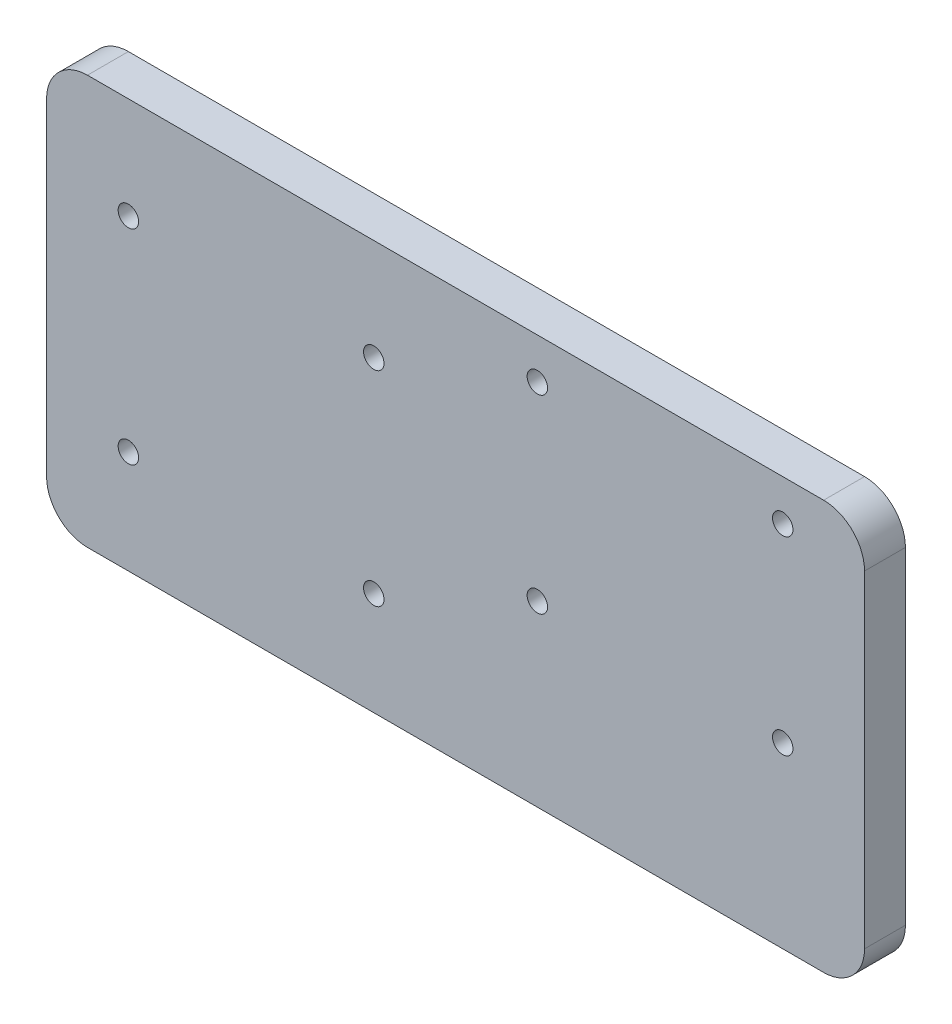
ISO-10303-21;
HEADER;
FILE_DESCRIPTION(('STEP AP214'),'2;1');
FILE_NAME('part.step','',(''),(''),'','','');
FILE_SCHEMA(('AUTOMOTIVE_DESIGN { 1 0 10303 214 1 1 1 1 }'));
ENDSEC;
DATA;
#1=APPLICATION_CONTEXT('core data for automotive mechanical design processes');
#2=APPLICATION_PROTOCOL_DEFINITION('international standard','automotive_design',2000,#1);
#3=PRODUCT_CONTEXT('',#1,'mechanical');
#4=PRODUCT('Part','Part','',(#3));
#5=PRODUCT_RELATED_PRODUCT_CATEGORY('part','',(#4));
#6=PRODUCT_DEFINITION_FORMATION('','',#4);
#7=PRODUCT_DEFINITION_CONTEXT('part definition',#1,'design');
#8=PRODUCT_DEFINITION('design','',#6,#7);
#9=PRODUCT_DEFINITION_SHAPE('','',#8);
#10=(LENGTH_UNIT() NAMED_UNIT(*) SI_UNIT(.MILLI.,.METRE.));
#11=(NAMED_UNIT(*) PLANE_ANGLE_UNIT() SI_UNIT($,.RADIAN.));
#12=(NAMED_UNIT(*) SI_UNIT($,.STERADIAN.) SOLID_ANGLE_UNIT());
#13=UNCERTAINTY_MEASURE_WITH_UNIT(LENGTH_MEASURE(1.E-05),#10,'distance_accuracy_value','');
#14=(GEOMETRIC_REPRESENTATION_CONTEXT(3) GLOBAL_UNCERTAINTY_ASSIGNED_CONTEXT((#13)) GLOBAL_UNIT_ASSIGNED_CONTEXT((#10,
#11,#12)) REPRESENTATION_CONTEXT('',''));
#15=CARTESIAN_POINT('',(0.,0.,0.));
#16=DIRECTION('',(0.,0.,1.));
#17=DIRECTION('',(1.,0.,0.));
#18=AXIS2_PLACEMENT_3D('',#15,#16,#17);
#19=CARTESIAN_POINT('',(0.,0.,10.));
#20=DIRECTION('',(1.,0.,0.));
#21=DIRECTION('',(0.,0.,-1.));
#22=AXIS2_PLACEMENT_3D('',#19,#20,#21);
#23=PLANE('',#22);
#24=DIRECTION('',(0.,-1.,0.));
#25=VECTOR('',#24,1.);
#26=CARTESIAN_POINT('',(0.,0.,0.));
#27=LINE('',#26,#25);
#28=CARTESIAN_POINT('',(0.,90.,0.));
#29=VERTEX_POINT('',#28);
#30=CARTESIAN_POINT('',(0.,10.,0.));
#31=VERTEX_POINT('',#30);
#32=EDGE_CURVE('E239',#29,#31,#27,.T.);
#33=ORIENTED_EDGE('',*,*,#32,.T.);
#34=DIRECTION('',(0.,0.,-1.));
#35=VECTOR('',#34,1.);
#36=CARTESIAN_POINT('',(0.,10.,10.));
#37=LINE('',#36,#35);
#38=CARTESIAN_POINT('',(0.,10.,10.));
#39=VERTEX_POINT('',#38);
#40=EDGE_CURVE('E275',#31,#39,#37,.F.);
#41=ORIENTED_EDGE('',*,*,#40,.T.);
#42=DIRECTION('',(0.,-1.,0.));
#43=VECTOR('',#42,1.);
#44=CARTESIAN_POINT('',(0.,0.,10.));
#45=LINE('',#44,#43);
#46=CARTESIAN_POINT('',(0.,90.,10.));
#47=VERTEX_POINT('',#46);
#48=EDGE_CURVE('E240',#47,#39,#45,.T.);
#49=ORIENTED_EDGE('',*,*,#48,.F.);
#50=DIRECTION('',(0.,0.,-1.));
#51=VECTOR('',#50,1.);
#52=CARTESIAN_POINT('',(0.,90.,10.));
#53=LINE('',#52,#51);
#54=EDGE_CURVE('E251',#47,#29,#53,.T.);
#55=ORIENTED_EDGE('',*,*,#54,.T.);
#56=EDGE_LOOP('',(#33,#41,#49,#55));
#57=FACE_BOUND('',#56,.T.);
#58=ADVANCED_FACE('F35',(#57),#23,.F.);
#59=CARTESIAN_POINT('',(0.,0.,10.));
#60=DIRECTION('',(0.,1.,0.));
#61=DIRECTION('',(0.,0.,1.));
#62=AXIS2_PLACEMENT_3D('',#59,#60,#61);
#63=PLANE('',#62);
#64=DIRECTION('',(1.,0.,0.));
#65=VECTOR('',#64,1.);
#66=CARTESIAN_POINT('',(0.,0.,0.));
#67=LINE('',#66,#65);
#68=CARTESIAN_POINT('',(10.,0.,0.));
#69=VERTEX_POINT('',#68);
#70=CARTESIAN_POINT('',(190.,0.,0.));
#71=VERTEX_POINT('',#70);
#72=EDGE_CURVE('E254',#69,#71,#67,.T.);
#73=ORIENTED_EDGE('',*,*,#72,.T.);
#74=DIRECTION('',(0.,0.,-1.));
#75=VECTOR('',#74,1.);
#76=CARTESIAN_POINT('',(190.,0.,10.));
#77=LINE('',#76,#75);
#78=CARTESIAN_POINT('',(190.,0.,10.));
#79=VERTEX_POINT('',#78);
#80=EDGE_CURVE('E284',#71,#79,#77,.F.);
#81=ORIENTED_EDGE('',*,*,#80,.T.);
#82=DIRECTION('',(1.,0.,0.));
#83=VECTOR('',#82,1.);
#84=CARTESIAN_POINT('',(0.,0.,10.));
#85=LINE('',#84,#83);
#86=CARTESIAN_POINT('',(10.,0.,10.));
#87=VERTEX_POINT('',#86);
#88=EDGE_CURVE('E243',#87,#79,#85,.T.);
#89=ORIENTED_EDGE('',*,*,#88,.F.);
#90=DIRECTION('',(0.,0.,-1.));
#91=VECTOR('',#90,1.);
#92=CARTESIAN_POINT('',(10.,0.,10.));
#93=LINE('',#92,#91);
#94=EDGE_CURVE('E270',#87,#69,#93,.T.);
#95=ORIENTED_EDGE('',*,*,#94,.T.);
#96=EDGE_LOOP('',(#73,#81,#89,#95));
#97=FACE_BOUND('',#96,.T.);
#98=ADVANCED_FACE('F316',(#97),#63,.F.);
#99=CARTESIAN_POINT('',(200.,0.,10.));
#100=DIRECTION('',(-1.,0.,0.));
#101=DIRECTION('',(0.,0.,1.));
#102=AXIS2_PLACEMENT_3D('',#99,#100,#101);
#103=PLANE('',#102);
#104=DIRECTION('',(0.,1.,0.));
#105=VECTOR('',#104,1.);
#106=CARTESIAN_POINT('',(200.,0.,0.));
#107=LINE('',#106,#105);
#108=CARTESIAN_POINT('',(200.,10.,0.));
#109=VERTEX_POINT('',#108);
#110=CARTESIAN_POINT('',(200.,90.,0.));
#111=VERTEX_POINT('',#110);
#112=EDGE_CURVE('E257',#109,#111,#107,.T.);
#113=ORIENTED_EDGE('',*,*,#112,.T.);
#114=DIRECTION('',(0.,0.,-1.));
#115=VECTOR('',#114,1.);
#116=CARTESIAN_POINT('',(200.,90.,10.));
#117=LINE('',#116,#115);
#118=CARTESIAN_POINT('',(200.,90.,10.));
#119=VERTEX_POINT('',#118);
#120=EDGE_CURVE('E43',#111,#119,#117,.F.);
#121=ORIENTED_EDGE('',*,*,#120,.T.);
#122=DIRECTION('',(0.,1.,0.));
#123=VECTOR('',#122,1.);
#124=CARTESIAN_POINT('',(200.,0.,10.));
#125=LINE('',#124,#123);
#126=CARTESIAN_POINT('',(200.,10.,10.));
#127=VERTEX_POINT('',#126);
#128=EDGE_CURVE('E247',#127,#119,#125,.T.);
#129=ORIENTED_EDGE('',*,*,#128,.F.);
#130=DIRECTION('',(0.,0.,-1.));
#131=VECTOR('',#130,1.);
#132=CARTESIAN_POINT('',(200.,10.,10.));
#133=LINE('',#132,#131);
#134=EDGE_CURVE('E279',#127,#109,#133,.T.);
#135=ORIENTED_EDGE('',*,*,#134,.T.);
#136=EDGE_LOOP('',(#113,#121,#129,#135));
#137=FACE_BOUND('',#136,.T.);
#138=ADVANCED_FACE('F322',(#137),#103,.F.);
#139=CARTESIAN_POINT('',(0.,100.,10.));
#140=DIRECTION('',(0.,-1.,0.));
#141=DIRECTION('',(0.,0.,-1.));
#142=AXIS2_PLACEMENT_3D('',#139,#140,#141);
#143=PLANE('',#142);
#144=DIRECTION('',(-1.,0.,0.));
#145=VECTOR('',#144,1.);
#146=CARTESIAN_POINT('',(0.,100.,10.));
#147=LINE('',#146,#145);
#148=CARTESIAN_POINT('',(190.,100.,10.));
#149=VERTEX_POINT('',#148);
#150=CARTESIAN_POINT('',(10.,100.,10.));
#151=VERTEX_POINT('',#150);
#152=EDGE_CURVE('E249',#149,#151,#147,.T.);
#153=ORIENTED_EDGE('',*,*,#152,.F.);
#154=DIRECTION('',(0.,0.,-1.));
#155=VECTOR('',#154,1.);
#156=CARTESIAN_POINT('',(190.,100.,10.));
#157=LINE('',#156,#155);
#158=CARTESIAN_POINT('',(190.,100.,0.));
#159=VERTEX_POINT('',#158);
#160=EDGE_CURVE('E288',#149,#159,#157,.T.);
#161=ORIENTED_EDGE('',*,*,#160,.T.);
#162=DIRECTION('',(-1.,0.,0.));
#163=VECTOR('',#162,1.);
#164=CARTESIAN_POINT('',(0.,100.,0.));
#165=LINE('',#164,#163);
#166=CARTESIAN_POINT('',(10.,100.,0.));
#167=VERTEX_POINT('',#166);
#168=EDGE_CURVE('E244',#159,#167,#165,.T.);
#169=ORIENTED_EDGE('',*,*,#168,.T.);
#170=DIRECTION('',(0.,0.,-1.));
#171=VECTOR('',#170,1.);
#172=CARTESIAN_POINT('',(10.,100.,10.));
#173=LINE('',#172,#171);
#174=EDGE_CURVE('E265',#167,#151,#173,.F.);
#175=ORIENTED_EDGE('',*,*,#174,.T.);
#176=EDGE_LOOP('',(#153,#161,#169,#175));
#177=FACE_BOUND('',#176,.T.);
#178=ADVANCED_FACE('F294',(#177),#143,.F.);
#179=CARTESIAN_POINT('',(0.,0.,10.));
#180=DIRECTION('',(0.,0.,-1.));
#181=DIRECTION('',(-1.,0.,0.));
#182=AXIS2_PLACEMENT_3D('',#179,#180,#181);
#183=PLANE('',#182);
#184=CARTESIAN_POINT('',(180.,43.628026433225,10.));
#185=DIRECTION('',(0.,0.,1.));
#186=DIRECTION('',(1.,0.,0.));
#187=AXIS2_PLACEMENT_3D('',#184,#185,#186);
#188=CIRCLE('',#187,2.5);
#189=CARTESIAN_POINT('',(182.5,43.628026433225,10.));
#190=VERTEX_POINT('',#189);
#191=EDGE_CURVE('E145',#190,#190,#188,.T.);
#192=ORIENTED_EDGE('',*,*,#191,.F.);
#193=EDGE_LOOP('',(#192));
#194=FACE_BOUND('',#193,.T.);
#195=CARTESIAN_POINT('',(120.,43.628026433225,10.));
#196=DIRECTION('',(0.,0.,1.));
#197=DIRECTION('',(1.,0.,0.));
#198=AXIS2_PLACEMENT_3D('',#195,#196,#197);
#199=CIRCLE('',#198,2.49999999999999);
#200=CARTESIAN_POINT('',(122.5,43.628026433225,10.));
#201=VERTEX_POINT('',#200);
#202=EDGE_CURVE('E144',#201,#201,#199,.T.);
#203=ORIENTED_EDGE('',*,*,#202,.F.);
#204=EDGE_LOOP('',(#203));
#205=FACE_BOUND('',#204,.T.);
#206=CARTESIAN_POINT('',(180.,90.,10.));
#207=DIRECTION('',(0.,0.,1.));
#208=DIRECTION('',(1.,0.,0.));
#209=AXIS2_PLACEMENT_3D('',#206,#207,#208);
#210=CIRCLE('',#209,2.5);
#211=CARTESIAN_POINT('',(182.5,90.,10.));
#212=VERTEX_POINT('',#211);
#213=EDGE_CURVE('E155',#212,#212,#210,.T.);
#214=ORIENTED_EDGE('',*,*,#213,.F.);
#215=EDGE_LOOP('',(#214));
#216=FACE_BOUND('',#215,.T.);
#217=CARTESIAN_POINT('',(120.,90.,10.));
#218=DIRECTION('',(0.,0.,1.));
#219=DIRECTION('',(1.,0.,0.));
#220=AXIS2_PLACEMENT_3D('',#217,#218,#219);
#221=CIRCLE('',#220,2.5);
#222=CARTESIAN_POINT('',(122.5,90.,10.));
#223=VERTEX_POINT('',#222);
#224=EDGE_CURVE('E161',#223,#223,#221,.T.);
#225=ORIENTED_EDGE('',*,*,#224,.F.);
#226=EDGE_LOOP('',(#225));
#227=FACE_BOUND('',#226,.T.);
#228=CARTESIAN_POINT('',(80.,25.2210198249188,10.));
#229=DIRECTION('',(0.,0.,1.));
#230=DIRECTION('',(1.,0.,0.));
#231=AXIS2_PLACEMENT_3D('',#228,#229,#230);
#232=CIRCLE('',#231,2.49999999999999);
#233=CARTESIAN_POINT('',(82.5,25.2210198249188,10.));
#234=VERTEX_POINT('',#233);
#235=EDGE_CURVE('E167',#234,#234,#232,.T.);
#236=ORIENTED_EDGE('',*,*,#235,.F.);
#237=EDGE_LOOP('',(#236));
#238=FACE_BOUND('',#237,.T.);
#239=CARTESIAN_POINT('',(20.,25.2210198249188,10.));
#240=DIRECTION('',(0.,0.,1.));
#241=DIRECTION('',(1.,0.,0.));
#242=AXIS2_PLACEMENT_3D('',#239,#240,#241);
#243=CIRCLE('',#242,2.49999999999999);
#244=CARTESIAN_POINT('',(22.5,25.2210198249188,10.));
#245=VERTEX_POINT('',#244);
#246=EDGE_CURVE('E173',#245,#245,#243,.T.);
#247=ORIENTED_EDGE('',*,*,#246,.F.);
#248=EDGE_LOOP('',(#247));
#249=FACE_BOUND('',#248,.T.);
#250=CARTESIAN_POINT('',(80.,75.1960198249188,10.));
#251=DIRECTION('',(0.,0.,1.));
#252=DIRECTION('',(1.,0.,0.));
#253=AXIS2_PLACEMENT_3D('',#250,#251,#252);
#254=CIRCLE('',#253,2.49999999999999);
#255=CARTESIAN_POINT('',(82.5,75.1960198249188,10.));
#256=VERTEX_POINT('',#255);
#257=EDGE_CURVE('E179',#256,#256,#254,.T.);
#258=ORIENTED_EDGE('',*,*,#257,.F.);
#259=EDGE_LOOP('',(#258));
#260=FACE_BOUND('',#259,.T.);
#261=CARTESIAN_POINT('',(20.,75.1960198249188,10.));
#262=DIRECTION('',(0.,0.,1.));
#263=DIRECTION('',(1.,0.,0.));
#264=AXIS2_PLACEMENT_3D('',#261,#262,#263);
#265=CIRCLE('',#264,2.49999999999999);
#266=CARTESIAN_POINT('',(22.5,75.1960198249188,10.));
#267=VERTEX_POINT('',#266);
#268=EDGE_CURVE('E185',#267,#267,#265,.T.);
#269=ORIENTED_EDGE('',*,*,#268,.F.);
#270=EDGE_LOOP('',(#269));
#271=FACE_BOUND('',#270,.T.);
#272=ORIENTED_EDGE('',*,*,#128,.T.);
#273=CARTESIAN_POINT('',(190.,90.,10.));
#274=DIRECTION('',(0.,0.,-1.));
#275=DIRECTION('',(-1.,0.,0.));
#276=AXIS2_PLACEMENT_3D('',#273,#274,#275);
#277=CIRCLE('',#276,10.);
#278=EDGE_CURVE('E11',#119,#149,#277,.F.);
#279=ORIENTED_EDGE('',*,*,#278,.T.);
#280=ORIENTED_EDGE('',*,*,#152,.T.);
#281=CARTESIAN_POINT('',(10.,90.,10.));
#282=DIRECTION('',(0.,0.,-1.));
#283=DIRECTION('',(-1.,0.,0.));
#284=AXIS2_PLACEMENT_3D('',#281,#282,#283);
#285=CIRCLE('',#284,10.);
#286=EDGE_CURVE('E268',#151,#47,#285,.F.);
#287=ORIENTED_EDGE('',*,*,#286,.T.);
#288=ORIENTED_EDGE('',*,*,#48,.T.);
#289=CARTESIAN_POINT('',(10.,10.,10.));
#290=DIRECTION('',(0.,0.,-1.));
#291=DIRECTION('',(-1.,0.,0.));
#292=AXIS2_PLACEMENT_3D('',#289,#290,#291);
#293=CIRCLE('',#292,10.);
#294=EDGE_CURVE('E277',#39,#87,#293,.F.);
#295=ORIENTED_EDGE('',*,*,#294,.T.);
#296=ORIENTED_EDGE('',*,*,#88,.T.);
#297=CARTESIAN_POINT('',(190.,10.,10.));
#298=DIRECTION('',(0.,0.,-1.));
#299=DIRECTION('',(-1.,0.,0.));
#300=AXIS2_PLACEMENT_3D('',#297,#298,#299);
#301=CIRCLE('',#300,10.);
#302=EDGE_CURVE('E286',#79,#127,#301,.F.);
#303=ORIENTED_EDGE('',*,*,#302,.T.);
#304=EDGE_LOOP('',(#272,#279,#280,#287,#288,#295,#296,#303));
#305=FACE_BOUND('',#304,.T.);
#306=ADVANCED_FACE('F306',(#194,#205,#216,#227,#238,#249,#260,#271,#305),#183,.F.);
#307=CARTESIAN_POINT('',(0.,0.,0.));
#308=DIRECTION('',(0.,0.,-1.));
#309=DIRECTION('',(-1.,0.,0.));
#310=AXIS2_PLACEMENT_3D('',#307,#308,#309);
#311=PLANE('',#310);
#312=CARTESIAN_POINT('',(80.,16.8140132166125,0.));
#313=DIRECTION('',(0.,0.,-1.));
#314=DIRECTION('',(-1.,0.,0.));
#315=AXIS2_PLACEMENT_3D('',#312,#313,#314);
#316=CIRCLE('',#315,3.99999999999999);
#317=CARTESIAN_POINT('',(76.,16.8140132166125,0.));
#318=VERTEX_POINT('',#317);
#319=EDGE_CURVE('E191',#318,#318,#316,.T.);
#320=ORIENTED_EDGE('',*,*,#319,.F.);
#321=EDGE_LOOP('',(#320));
#322=FACE_BOUND('',#321,.T.);
#323=CARTESIAN_POINT('',(20.,16.8140132166125,0.));
#324=DIRECTION('',(0.,0.,-1.));
#325=DIRECTION('',(-1.,0.,0.));
#326=AXIS2_PLACEMENT_3D('',#323,#324,#325);
#327=CIRCLE('',#326,3.99999999999999);
#328=CARTESIAN_POINT('',(16.,16.8140132166125,0.));
#329=VERTEX_POINT('',#328);
#330=EDGE_CURVE('E203',#329,#329,#327,.T.);
#331=ORIENTED_EDGE('',*,*,#330,.F.);
#332=EDGE_LOOP('',(#331));
#333=FACE_BOUND('',#332,.T.);
#334=CARTESIAN_POINT('',(20.,83.4640132166125,0.));
#335=DIRECTION('',(0.,0.,-1.));
#336=DIRECTION('',(-1.,0.,0.));
#337=AXIS2_PLACEMENT_3D('',#334,#335,#336);
#338=CIRCLE('',#337,3.99999999999999);
#339=CARTESIAN_POINT('',(16.,83.4640132166125,0.));
#340=VERTEX_POINT('',#339);
#341=EDGE_CURVE('E215',#340,#340,#338,.T.);
#342=ORIENTED_EDGE('',*,*,#341,.F.);
#343=EDGE_LOOP('',(#342));
#344=FACE_BOUND('',#343,.T.);
#345=CARTESIAN_POINT('',(80.,83.4640132166125,0.));
#346=DIRECTION('',(0.,0.,-1.));
#347=DIRECTION('',(-1.,0.,0.));
#348=AXIS2_PLACEMENT_3D('',#345,#346,#347);
#349=CIRCLE('',#348,3.99999999999999);
#350=CARTESIAN_POINT('',(76.,83.4640132166125,0.));
#351=VERTEX_POINT('',#350);
#352=EDGE_CURVE('E227',#351,#351,#349,.T.);
#353=ORIENTED_EDGE('',*,*,#352,.F.);
#354=EDGE_LOOP('',(#353));
#355=FACE_BOUND('',#354,.T.);
#356=ORIENTED_EDGE('',*,*,#168,.F.);
#357=CARTESIAN_POINT('',(190.,90.,0.));
#358=DIRECTION('',(0.,0.,-1.));
#359=DIRECTION('',(-1.,0.,0.));
#360=AXIS2_PLACEMENT_3D('',#357,#358,#359);
#361=CIRCLE('',#360,10.);
#362=EDGE_CURVE('E57',#159,#111,#361,.T.);
#363=ORIENTED_EDGE('',*,*,#362,.T.);
#364=ORIENTED_EDGE('',*,*,#112,.F.);
#365=CARTESIAN_POINT('',(190.,10.,0.));
#366=DIRECTION('',(0.,0.,-1.));
#367=DIRECTION('',(-1.,0.,0.));
#368=AXIS2_PLACEMENT_3D('',#365,#366,#367);
#369=CIRCLE('',#368,10.);
#370=EDGE_CURVE('E282',#109,#71,#369,.T.);
#371=ORIENTED_EDGE('',*,*,#370,.T.);
#372=ORIENTED_EDGE('',*,*,#72,.F.);
#373=CARTESIAN_POINT('',(10.,10.,0.));
#374=DIRECTION('',(0.,0.,-1.));
#375=DIRECTION('',(-1.,0.,0.));
#376=AXIS2_PLACEMENT_3D('',#373,#374,#375);
#377=CIRCLE('',#376,10.);
#378=EDGE_CURVE('E273',#69,#31,#377,.T.);
#379=ORIENTED_EDGE('',*,*,#378,.T.);
#380=ORIENTED_EDGE('',*,*,#32,.F.);
#381=CARTESIAN_POINT('',(10.,90.,0.));
#382=DIRECTION('',(0.,0.,-1.));
#383=DIRECTION('',(-1.,0.,0.));
#384=AXIS2_PLACEMENT_3D('',#381,#382,#383);
#385=CIRCLE('',#384,10.);
#386=EDGE_CURVE('E262',#29,#167,#385,.T.);
#387=ORIENTED_EDGE('',*,*,#386,.T.);
#388=EDGE_LOOP('',(#356,#363,#364,#371,#372,#379,#380,#387));
#389=FACE_BOUND('',#388,.T.);
#390=ADVANCED_FACE('F297',(#322,#333,#344,#355,#389),#311,.T.);
#391=CARTESIAN_POINT('',(80.,83.4640132166125,7.99999999999999));
#392=DIRECTION('',(0.,0.,-1.));
#393=DIRECTION('',(-1.,0.,0.));
#394=AXIS2_PLACEMENT_3D('',#391,#392,#393);
#395=CONICAL_SURFACE('',#394,3.,1.02974425867665);
#396=CARTESIAN_POINT('',(80.,83.4640132166125,9.80258185708268));
#397=VERTEX_POINT('',#396);
#398=VERTEX_LOOP('',#397);
#399=FACE_BOUND('',#398,.T.);
#400=CARTESIAN_POINT('',(80.,83.4640132166125,7.99999999999999));
#401=DIRECTION('',(0.,0.,-1.));
#402=DIRECTION('',(-1.,0.,0.));
#403=AXIS2_PLACEMENT_3D('',#400,#401,#402);
#404=CIRCLE('',#403,3.);
#405=CARTESIAN_POINT('',(77.,83.4640132166125,7.99999999999999));
#406=VERTEX_POINT('',#405);
#407=EDGE_CURVE('E236',#406,#406,#404,.T.);
#408=ORIENTED_EDGE('',*,*,#407,.T.);
#409=EDGE_LOOP('',(#408));
#410=FACE_BOUND('',#409,.T.);
#411=ADVANCED_FACE('F383',(#399,#410),#395,.F.);
#412=CARTESIAN_POINT('',(80.,83.4640132166125,0.));
#413=DIRECTION('',(0.,0.,-1.));
#414=DIRECTION('',(-1.,0.,0.));
#415=AXIS2_PLACEMENT_3D('',#412,#413,#414);
#416=CYLINDRICAL_SURFACE('',#415,3.);
#417=ORIENTED_EDGE('',*,*,#407,.F.);
#418=EDGE_LOOP('',(#417));
#419=FACE_BOUND('',#418,.T.);
#420=CARTESIAN_POINT('',(80.,83.4640132166125,2.));
#421=DIRECTION('',(0.,0.,-1.));
#422=DIRECTION('',(-1.,0.,0.));
#423=AXIS2_PLACEMENT_3D('',#420,#421,#422);
#424=CIRCLE('',#423,3.);
#425=CARTESIAN_POINT('',(77.,83.4640132166125,2.));
#426=VERTEX_POINT('',#425);
#427=EDGE_CURVE('E233',#426,#426,#424,.T.);
#428=ORIENTED_EDGE('',*,*,#427,.T.);
#429=EDGE_LOOP('',(#428));
#430=FACE_BOUND('',#429,.T.);
#431=ADVANCED_FACE('F397',(#419,#430),#416,.F.);
#432=CARTESIAN_POINT('',(83.,83.4640132166125,2.));
#433=DIRECTION('',(0.,0.,1.));
#434=DIRECTION('',(1.,0.,0.));
#435=AXIS2_PLACEMENT_3D('',#432,#433,#434);
#436=PLANE('',#435);
#437=ORIENTED_EDGE('',*,*,#427,.F.);
#438=EDGE_LOOP('',(#437));
#439=FACE_BOUND('',#438,.T.);
#440=CARTESIAN_POINT('',(80.,83.4640132166125,2.));
#441=DIRECTION('',(0.,0.,-1.));
#442=DIRECTION('',(-1.,0.,0.));
#443=AXIS2_PLACEMENT_3D('',#440,#441,#442);
#444=CIRCLE('',#443,3.99999999999999);
#445=CARTESIAN_POINT('',(76.,83.4640132166125,2.));
#446=VERTEX_POINT('',#445);
#447=EDGE_CURVE('E230',#446,#446,#444,.T.);
#448=ORIENTED_EDGE('',*,*,#447,.T.);
#449=EDGE_LOOP('',(#448));
#450=FACE_BOUND('',#449,.T.);
#451=ADVANCED_FACE('F404',(#439,#450),#436,.F.);
#452=CARTESIAN_POINT('',(80.,83.4640132166125,0.));
#453=DIRECTION('',(0.,0.,-1.));
#454=DIRECTION('',(-1.,0.,0.));
#455=AXIS2_PLACEMENT_3D('',#452,#453,#454);
#456=CYLINDRICAL_SURFACE('',#455,3.99999999999999);
#457=ORIENTED_EDGE('',*,*,#447,.F.);
#458=EDGE_LOOP('',(#457));
#459=FACE_BOUND('',#458,.T.);
#460=ORIENTED_EDGE('',*,*,#352,.T.);
#461=EDGE_LOOP('',(#460));
#462=FACE_BOUND('',#461,.T.);
#463=ADVANCED_FACE('F412',(#459,#462),#456,.F.);
#464=CARTESIAN_POINT('',(20.,83.4640132166125,7.99999999999999));
#465=DIRECTION('',(0.,0.,-1.));
#466=DIRECTION('',(-1.,0.,0.));
#467=AXIS2_PLACEMENT_3D('',#464,#465,#466);
#468=CONICAL_SURFACE('',#467,3.,1.02974425867665);
#469=CARTESIAN_POINT('',(20.,83.4640132166125,9.80258185708268));
#470=VERTEX_POINT('',#469);
#471=VERTEX_LOOP('',#470);
#472=FACE_BOUND('',#471,.T.);
#473=CARTESIAN_POINT('',(20.,83.4640132166125,7.99999999999999));
#474=DIRECTION('',(0.,0.,-1.));
#475=DIRECTION('',(-1.,0.,0.));
#476=AXIS2_PLACEMENT_3D('',#473,#474,#475);
#477=CIRCLE('',#476,3.);
#478=CARTESIAN_POINT('',(17.,83.4640132166125,7.99999999999999));
#479=VERTEX_POINT('',#478);
#480=EDGE_CURVE('E224',#479,#479,#477,.T.);
#481=ORIENTED_EDGE('',*,*,#480,.T.);
#482=EDGE_LOOP('',(#481));
#483=FACE_BOUND('',#482,.T.);
#484=ADVANCED_FACE('F420',(#472,#483),#468,.F.);
#485=CARTESIAN_POINT('',(20.,83.4640132166125,0.));
#486=DIRECTION('',(0.,0.,-1.));
#487=DIRECTION('',(-1.,0.,0.));
#488=AXIS2_PLACEMENT_3D('',#485,#486,#487);
#489=CYLINDRICAL_SURFACE('',#488,3.);
#490=ORIENTED_EDGE('',*,*,#480,.F.);
#491=EDGE_LOOP('',(#490));
#492=FACE_BOUND('',#491,.T.);
#493=CARTESIAN_POINT('',(20.,83.4640132166125,2.));
#494=DIRECTION('',(0.,0.,-1.));
#495=DIRECTION('',(-1.,0.,0.));
#496=AXIS2_PLACEMENT_3D('',#493,#494,#495);
#497=CIRCLE('',#496,3.);
#498=CARTESIAN_POINT('',(17.,83.4640132166125,2.));
#499=VERTEX_POINT('',#498);
#500=EDGE_CURVE('E221',#499,#499,#497,.T.);
#501=ORIENTED_EDGE('',*,*,#500,.T.);
#502=EDGE_LOOP('',(#501));
#503=FACE_BOUND('',#502,.T.);
#504=ADVANCED_FACE('F428',(#492,#503),#489,.F.);
#505=CARTESIAN_POINT('',(23.,83.4640132166125,2.));
#506=DIRECTION('',(0.,0.,1.));
#507=DIRECTION('',(1.,0.,0.));
#508=AXIS2_PLACEMENT_3D('',#505,#506,#507);
#509=PLANE('',#508);
#510=ORIENTED_EDGE('',*,*,#500,.F.);
#511=EDGE_LOOP('',(#510));
#512=FACE_BOUND('',#511,.T.);
#513=CARTESIAN_POINT('',(20.,83.4640132166125,2.));
#514=DIRECTION('',(0.,0.,-1.));
#515=DIRECTION('',(-1.,0.,0.));
#516=AXIS2_PLACEMENT_3D('',#513,#514,#515);
#517=CIRCLE('',#516,3.99999999999999);
#518=CARTESIAN_POINT('',(16.,83.4640132166125,2.));
#519=VERTEX_POINT('',#518);
#520=EDGE_CURVE('E218',#519,#519,#517,.T.);
#521=ORIENTED_EDGE('',*,*,#520,.T.);
#522=EDGE_LOOP('',(#521));
#523=FACE_BOUND('',#522,.T.);
#524=ADVANCED_FACE('F436',(#512,#523),#509,.F.);
#525=CARTESIAN_POINT('',(20.,83.4640132166125,0.));
#526=DIRECTION('',(0.,0.,-1.));
#527=DIRECTION('',(-1.,0.,0.));
#528=AXIS2_PLACEMENT_3D('',#525,#526,#527);
#529=CYLINDRICAL_SURFACE('',#528,3.99999999999999);
#530=ORIENTED_EDGE('',*,*,#520,.F.);
#531=EDGE_LOOP('',(#530));
#532=FACE_BOUND('',#531,.T.);
#533=ORIENTED_EDGE('',*,*,#341,.T.);
#534=EDGE_LOOP('',(#533));
#535=FACE_BOUND('',#534,.T.);
#536=ADVANCED_FACE('F444',(#532,#535),#529,.F.);
#537=CARTESIAN_POINT('',(20.,16.8140132166125,7.99999999999999));
#538=DIRECTION('',(0.,0.,-1.));
#539=DIRECTION('',(-1.,0.,0.));
#540=AXIS2_PLACEMENT_3D('',#537,#538,#539);
#541=CONICAL_SURFACE('',#540,3.,1.02974425867665);
#542=CARTESIAN_POINT('',(20.,16.8140132166125,9.80258185708268));
#543=VERTEX_POINT('',#542);
#544=VERTEX_LOOP('',#543);
#545=FACE_BOUND('',#544,.T.);
#546=CARTESIAN_POINT('',(20.,16.8140132166125,7.99999999999999));
#547=DIRECTION('',(0.,0.,-1.));
#548=DIRECTION('',(-1.,0.,0.));
#549=AXIS2_PLACEMENT_3D('',#546,#547,#548);
#550=CIRCLE('',#549,3.);
#551=CARTESIAN_POINT('',(17.,16.8140132166125,7.99999999999999));
#552=VERTEX_POINT('',#551);
#553=EDGE_CURVE('E212',#552,#552,#550,.T.);
#554=ORIENTED_EDGE('',*,*,#553,.T.);
#555=EDGE_LOOP('',(#554));
#556=FACE_BOUND('',#555,.T.);
#557=ADVANCED_FACE('F452',(#545,#556),#541,.F.);
#558=CARTESIAN_POINT('',(20.,16.8140132166125,0.));
#559=DIRECTION('',(0.,0.,-1.));
#560=DIRECTION('',(-1.,0.,0.));
#561=AXIS2_PLACEMENT_3D('',#558,#559,#560);
#562=CYLINDRICAL_SURFACE('',#561,3.);
#563=ORIENTED_EDGE('',*,*,#553,.F.);
#564=EDGE_LOOP('',(#563));
#565=FACE_BOUND('',#564,.T.);
#566=CARTESIAN_POINT('',(20.,16.8140132166125,2.));
#567=DIRECTION('',(0.,0.,-1.));
#568=DIRECTION('',(-1.,0.,0.));
#569=AXIS2_PLACEMENT_3D('',#566,#567,#568);
#570=CIRCLE('',#569,3.);
#571=CARTESIAN_POINT('',(17.,16.8140132166125,2.));
#572=VERTEX_POINT('',#571);
#573=EDGE_CURVE('E209',#572,#572,#570,.T.);
#574=ORIENTED_EDGE('',*,*,#573,.T.);
#575=EDGE_LOOP('',(#574));
#576=FACE_BOUND('',#575,.T.);
#577=ADVANCED_FACE('F460',(#565,#576),#562,.F.);
#578=CARTESIAN_POINT('',(23.,16.8140132166125,2.));
#579=DIRECTION('',(0.,0.,1.));
#580=DIRECTION('',(1.,0.,0.));
#581=AXIS2_PLACEMENT_3D('',#578,#579,#580);
#582=PLANE('',#581);
#583=ORIENTED_EDGE('',*,*,#573,.F.);
#584=EDGE_LOOP('',(#583));
#585=FACE_BOUND('',#584,.T.);
#586=CARTESIAN_POINT('',(20.,16.8140132166125,2.));
#587=DIRECTION('',(0.,0.,-1.));
#588=DIRECTION('',(-1.,0.,0.));
#589=AXIS2_PLACEMENT_3D('',#586,#587,#588);
#590=CIRCLE('',#589,3.99999999999999);
#591=CARTESIAN_POINT('',(16.,16.8140132166125,2.));
#592=VERTEX_POINT('',#591);
#593=EDGE_CURVE('E206',#592,#592,#590,.T.);
#594=ORIENTED_EDGE('',*,*,#593,.T.);
#595=EDGE_LOOP('',(#594));
#596=FACE_BOUND('',#595,.T.);
#597=ADVANCED_FACE('F468',(#585,#596),#582,.F.);
#598=CARTESIAN_POINT('',(20.,16.8140132166125,0.));
#599=DIRECTION('',(0.,0.,-1.));
#600=DIRECTION('',(-1.,0.,0.));
#601=AXIS2_PLACEMENT_3D('',#598,#599,#600);
#602=CYLINDRICAL_SURFACE('',#601,3.99999999999999);
#603=ORIENTED_EDGE('',*,*,#593,.F.);
#604=EDGE_LOOP('',(#603));
#605=FACE_BOUND('',#604,.T.);
#606=ORIENTED_EDGE('',*,*,#330,.T.);
#607=EDGE_LOOP('',(#606));
#608=FACE_BOUND('',#607,.T.);
#609=ADVANCED_FACE('F476',(#605,#608),#602,.F.);
#610=CARTESIAN_POINT('',(80.,16.8140132166125,7.99999999999999));
#611=DIRECTION('',(0.,0.,-1.));
#612=DIRECTION('',(-1.,0.,0.));
#613=AXIS2_PLACEMENT_3D('',#610,#611,#612);
#614=CONICAL_SURFACE('',#613,3.,1.02974425867665);
#615=CARTESIAN_POINT('',(80.,16.8140132166125,9.80258185708268));
#616=VERTEX_POINT('',#615);
#617=VERTEX_LOOP('',#616);
#618=FACE_BOUND('',#617,.T.);
#619=CARTESIAN_POINT('',(80.,16.8140132166125,7.99999999999999));
#620=DIRECTION('',(0.,0.,-1.));
#621=DIRECTION('',(-1.,0.,0.));
#622=AXIS2_PLACEMENT_3D('',#619,#620,#621);
#623=CIRCLE('',#622,3.);
#624=CARTESIAN_POINT('',(77.,16.8140132166125,7.99999999999999));
#625=VERTEX_POINT('',#624);
#626=EDGE_CURVE('E200',#625,#625,#623,.T.);
#627=ORIENTED_EDGE('',*,*,#626,.T.);
#628=EDGE_LOOP('',(#627));
#629=FACE_BOUND('',#628,.T.);
#630=ADVANCED_FACE('F484',(#618,#629),#614,.F.);
#631=CARTESIAN_POINT('',(80.,16.8140132166125,0.));
#632=DIRECTION('',(0.,0.,-1.));
#633=DIRECTION('',(-1.,0.,0.));
#634=AXIS2_PLACEMENT_3D('',#631,#632,#633);
#635=CYLINDRICAL_SURFACE('',#634,3.);
#636=ORIENTED_EDGE('',*,*,#626,.F.);
#637=EDGE_LOOP('',(#636));
#638=FACE_BOUND('',#637,.T.);
#639=CARTESIAN_POINT('',(80.,16.8140132166125,2.));
#640=DIRECTION('',(0.,0.,-1.));
#641=DIRECTION('',(-1.,0.,0.));
#642=AXIS2_PLACEMENT_3D('',#639,#640,#641);
#643=CIRCLE('',#642,3.);
#644=CARTESIAN_POINT('',(77.,16.8140132166125,2.));
#645=VERTEX_POINT('',#644);
#646=EDGE_CURVE('E197',#645,#645,#643,.T.);
#647=ORIENTED_EDGE('',*,*,#646,.T.);
#648=EDGE_LOOP('',(#647));
#649=FACE_BOUND('',#648,.T.);
#650=ADVANCED_FACE('F492',(#638,#649),#635,.F.);
#651=CARTESIAN_POINT('',(83.,16.8140132166125,2.));
#652=DIRECTION('',(0.,0.,1.));
#653=DIRECTION('',(1.,0.,0.));
#654=AXIS2_PLACEMENT_3D('',#651,#652,#653);
#655=PLANE('',#654);
#656=ORIENTED_EDGE('',*,*,#646,.F.);
#657=EDGE_LOOP('',(#656));
#658=FACE_BOUND('',#657,.T.);
#659=CARTESIAN_POINT('',(80.,16.8140132166125,2.));
#660=DIRECTION('',(0.,0.,-1.));
#661=DIRECTION('',(-1.,0.,0.));
#662=AXIS2_PLACEMENT_3D('',#659,#660,#661);
#663=CIRCLE('',#662,3.99999999999999);
#664=CARTESIAN_POINT('',(76.,16.8140132166125,2.));
#665=VERTEX_POINT('',#664);
#666=EDGE_CURVE('E194',#665,#665,#663,.T.);
#667=ORIENTED_EDGE('',*,*,#666,.T.);
#668=EDGE_LOOP('',(#667));
#669=FACE_BOUND('',#668,.T.);
#670=ADVANCED_FACE('F500',(#658,#669),#655,.F.);
#671=CARTESIAN_POINT('',(80.,16.8140132166125,0.));
#672=DIRECTION('',(0.,0.,-1.));
#673=DIRECTION('',(-1.,0.,0.));
#674=AXIS2_PLACEMENT_3D('',#671,#672,#673);
#675=CYLINDRICAL_SURFACE('',#674,3.99999999999999);
#676=ORIENTED_EDGE('',*,*,#666,.F.);
#677=EDGE_LOOP('',(#676));
#678=FACE_BOUND('',#677,.T.);
#679=ORIENTED_EDGE('',*,*,#319,.T.);
#680=EDGE_LOOP('',(#679));
#681=FACE_BOUND('',#680,.T.);
#682=ADVANCED_FACE('F508',(#678,#681),#675,.F.);
#683=CARTESIAN_POINT('',(20.,75.1960198249188,2.00000000000001));
#684=DIRECTION('',(0.,0.,1.));
#685=DIRECTION('',(1.,0.,0.));
#686=AXIS2_PLACEMENT_3D('',#683,#684,#685);
#687=CONICAL_SURFACE('',#686,2.49999999999999,1.02974425867665);
#688=CARTESIAN_POINT('',(20.,75.1960198249188,0.4978484524311));
#689=VERTEX_POINT('',#688);
#690=VERTEX_LOOP('',#689);
#691=FACE_BOUND('',#690,.T.);
#692=CARTESIAN_POINT('',(20.,75.1960198249188,2.00000000000001));
#693=DIRECTION('',(0.,0.,1.));
#694=DIRECTION('',(1.,0.,0.));
#695=AXIS2_PLACEMENT_3D('',#692,#693,#694);
#696=CIRCLE('',#695,2.49999999999999);
#697=CARTESIAN_POINT('',(22.5,75.1960198249188,2.00000000000001));
#698=VERTEX_POINT('',#697);
#699=EDGE_CURVE('E188',#698,#698,#696,.T.);
#700=ORIENTED_EDGE('',*,*,#699,.T.);
#701=EDGE_LOOP('',(#700));
#702=FACE_BOUND('',#701,.T.);
#703=ADVANCED_FACE('F516',(#691,#702),#687,.F.);
#704=CARTESIAN_POINT('',(20.,75.1960198249188,10.));
#705=DIRECTION('',(0.,0.,1.));
#706=DIRECTION('',(1.,0.,0.));
#707=AXIS2_PLACEMENT_3D('',#704,#705,#706);
#708=CYLINDRICAL_SURFACE('',#707,2.49999999999999);
#709=ORIENTED_EDGE('',*,*,#699,.F.);
#710=EDGE_LOOP('',(#709));
#711=FACE_BOUND('',#710,.T.);
#712=ORIENTED_EDGE('',*,*,#268,.T.);
#713=EDGE_LOOP('',(#712));
#714=FACE_BOUND('',#713,.T.);
#715=ADVANCED_FACE('F524',(#711,#714),#708,.F.);
#716=CARTESIAN_POINT('',(80.,75.1960198249188,2.00000000000001));
#717=DIRECTION('',(0.,0.,1.));
#718=DIRECTION('',(1.,0.,0.));
#719=AXIS2_PLACEMENT_3D('',#716,#717,#718);
#720=CONICAL_SURFACE('',#719,2.49999999999999,1.02974425867665);
#721=CARTESIAN_POINT('',(80.,75.1960198249188,0.4978484524311));
#722=VERTEX_POINT('',#721);
#723=VERTEX_LOOP('',#722);
#724=FACE_BOUND('',#723,.T.);
#725=CARTESIAN_POINT('',(80.,75.1960198249188,2.00000000000001));
#726=DIRECTION('',(0.,0.,1.));
#727=DIRECTION('',(1.,0.,0.));
#728=AXIS2_PLACEMENT_3D('',#725,#726,#727);
#729=CIRCLE('',#728,2.49999999999999);
#730=CARTESIAN_POINT('',(82.5,75.1960198249188,2.00000000000001));
#731=VERTEX_POINT('',#730);
#732=EDGE_CURVE('E182',#731,#731,#729,.T.);
#733=ORIENTED_EDGE('',*,*,#732,.T.);
#734=EDGE_LOOP('',(#733));
#735=FACE_BOUND('',#734,.T.);
#736=ADVANCED_FACE('F532',(#724,#735),#720,.F.);
#737=CARTESIAN_POINT('',(80.,75.1960198249188,10.));
#738=DIRECTION('',(0.,0.,1.));
#739=DIRECTION('',(1.,0.,0.));
#740=AXIS2_PLACEMENT_3D('',#737,#738,#739);
#741=CYLINDRICAL_SURFACE('',#740,2.49999999999999);
#742=ORIENTED_EDGE('',*,*,#732,.F.);
#743=EDGE_LOOP('',(#742));
#744=FACE_BOUND('',#743,.T.);
#745=ORIENTED_EDGE('',*,*,#257,.T.);
#746=EDGE_LOOP('',(#745));
#747=FACE_BOUND('',#746,.T.);
#748=ADVANCED_FACE('F540',(#744,#747),#741,.F.);
#749=CARTESIAN_POINT('',(20.,25.2210198249188,2.00000000000001));
#750=DIRECTION('',(0.,0.,1.));
#751=DIRECTION('',(1.,0.,0.));
#752=AXIS2_PLACEMENT_3D('',#749,#750,#751);
#753=CONICAL_SURFACE('',#752,2.49999999999999,1.02974425867665);
#754=CARTESIAN_POINT('',(20.,25.2210198249188,0.4978484524311));
#755=VERTEX_POINT('',#754);
#756=VERTEX_LOOP('',#755);
#757=FACE_BOUND('',#756,.T.);
#758=CARTESIAN_POINT('',(20.,25.2210198249188,2.00000000000001));
#759=DIRECTION('',(0.,0.,1.));
#760=DIRECTION('',(1.,0.,0.));
#761=AXIS2_PLACEMENT_3D('',#758,#759,#760);
#762=CIRCLE('',#761,2.49999999999999);
#763=CARTESIAN_POINT('',(22.5,25.2210198249188,2.00000000000001));
#764=VERTEX_POINT('',#763);
#765=EDGE_CURVE('E176',#764,#764,#762,.T.);
#766=ORIENTED_EDGE('',*,*,#765,.T.);
#767=EDGE_LOOP('',(#766));
#768=FACE_BOUND('',#767,.T.);
#769=ADVANCED_FACE('F548',(#757,#768),#753,.F.);
#770=CARTESIAN_POINT('',(20.,25.2210198249188,10.));
#771=DIRECTION('',(0.,0.,1.));
#772=DIRECTION('',(1.,0.,0.));
#773=AXIS2_PLACEMENT_3D('',#770,#771,#772);
#774=CYLINDRICAL_SURFACE('',#773,2.49999999999999);
#775=ORIENTED_EDGE('',*,*,#765,.F.);
#776=EDGE_LOOP('',(#775));
#777=FACE_BOUND('',#776,.T.);
#778=ORIENTED_EDGE('',*,*,#246,.T.);
#779=EDGE_LOOP('',(#778));
#780=FACE_BOUND('',#779,.T.);
#781=ADVANCED_FACE('F556',(#777,#780),#774,.F.);
#782=CARTESIAN_POINT('',(80.,25.2210198249188,2.00000000000001));
#783=DIRECTION('',(0.,0.,1.));
#784=DIRECTION('',(1.,0.,0.));
#785=AXIS2_PLACEMENT_3D('',#782,#783,#784);
#786=CONICAL_SURFACE('',#785,2.49999999999999,1.02974425867665);
#787=CARTESIAN_POINT('',(80.,25.2210198249188,0.4978484524311));
#788=VERTEX_POINT('',#787);
#789=VERTEX_LOOP('',#788);
#790=FACE_BOUND('',#789,.T.);
#791=CARTESIAN_POINT('',(80.,25.2210198249188,2.00000000000001));
#792=DIRECTION('',(0.,0.,1.));
#793=DIRECTION('',(1.,0.,0.));
#794=AXIS2_PLACEMENT_3D('',#791,#792,#793);
#795=CIRCLE('',#794,2.49999999999999);
#796=CARTESIAN_POINT('',(82.5,25.2210198249188,2.00000000000001));
#797=VERTEX_POINT('',#796);
#798=EDGE_CURVE('E170',#797,#797,#795,.T.);
#799=ORIENTED_EDGE('',*,*,#798,.T.);
#800=EDGE_LOOP('',(#799));
#801=FACE_BOUND('',#800,.T.);
#802=ADVANCED_FACE('F564',(#790,#801),#786,.F.);
#803=CARTESIAN_POINT('',(80.,25.2210198249188,10.));
#804=DIRECTION('',(0.,0.,1.));
#805=DIRECTION('',(1.,0.,0.));
#806=AXIS2_PLACEMENT_3D('',#803,#804,#805);
#807=CYLINDRICAL_SURFACE('',#806,2.49999999999999);
#808=ORIENTED_EDGE('',*,*,#798,.F.);
#809=EDGE_LOOP('',(#808));
#810=FACE_BOUND('',#809,.T.);
#811=ORIENTED_EDGE('',*,*,#235,.T.);
#812=EDGE_LOOP('',(#811));
#813=FACE_BOUND('',#812,.T.);
#814=ADVANCED_FACE('F572',(#810,#813),#807,.F.);
#815=CARTESIAN_POINT('',(120.,90.,2.));
#816=DIRECTION('',(0.,0.,1.));
#817=DIRECTION('',(1.,0.,0.));
#818=AXIS2_PLACEMENT_3D('',#815,#816,#817);
#819=CONICAL_SURFACE('',#818,2.5,1.02974425867666);
#820=CARTESIAN_POINT('',(120.,90.,0.4978484524311));
#821=VERTEX_POINT('',#820);
#822=VERTEX_LOOP('',#821);
#823=FACE_BOUND('',#822,.T.);
#824=CARTESIAN_POINT('',(120.,90.,2.));
#825=DIRECTION('',(0.,0.,1.));
#826=DIRECTION('',(1.,0.,0.));
#827=AXIS2_PLACEMENT_3D('',#824,#825,#826);
#828=CIRCLE('',#827,2.5);
#829=CARTESIAN_POINT('',(122.5,90.,2.));
#830=VERTEX_POINT('',#829);
#831=EDGE_CURVE('E164',#830,#830,#828,.T.);
#832=ORIENTED_EDGE('',*,*,#831,.T.);
#833=EDGE_LOOP('',(#832));
#834=FACE_BOUND('',#833,.T.);
#835=ADVANCED_FACE('F580',(#823,#834),#819,.F.);
#836=CARTESIAN_POINT('',(120.,90.,10.));
#837=DIRECTION('',(0.,0.,1.));
#838=DIRECTION('',(1.,0.,0.));
#839=AXIS2_PLACEMENT_3D('',#836,#837,#838);
#840=CYLINDRICAL_SURFACE('',#839,2.5);
#841=ORIENTED_EDGE('',*,*,#831,.F.);
#842=EDGE_LOOP('',(#841));
#843=FACE_BOUND('',#842,.T.);
#844=ORIENTED_EDGE('',*,*,#224,.T.);
#845=EDGE_LOOP('',(#844));
#846=FACE_BOUND('',#845,.T.);
#847=ADVANCED_FACE('F588',(#843,#846),#840,.F.);
#848=CARTESIAN_POINT('',(180.,90.,2.00000000000001));
#849=DIRECTION('',(0.,0.,1.));
#850=DIRECTION('',(1.,0.,0.));
#851=AXIS2_PLACEMENT_3D('',#848,#849,#850);
#852=CONICAL_SURFACE('',#851,2.49999999999997,1.02974425867665);
#853=CARTESIAN_POINT('',(180.,90.,0.4978484524311));
#854=VERTEX_POINT('',#853);
#855=VERTEX_LOOP('',#854);
#856=FACE_BOUND('',#855,.T.);
#857=CARTESIAN_POINT('',(180.,90.,2.00000000000001));
#858=DIRECTION('',(0.,0.,1.));
#859=DIRECTION('',(1.,0.,0.));
#860=AXIS2_PLACEMENT_3D('',#857,#858,#859);
#861=CIRCLE('',#860,2.49999999999997);
#862=CARTESIAN_POINT('',(182.5,90.,2.00000000000001));
#863=VERTEX_POINT('',#862);
#864=EDGE_CURVE('E158',#863,#863,#861,.T.);
#865=ORIENTED_EDGE('',*,*,#864,.T.);
#866=EDGE_LOOP('',(#865));
#867=FACE_BOUND('',#866,.T.);
#868=ADVANCED_FACE('F597',(#856,#867),#852,.F.);
#869=CARTESIAN_POINT('',(180.,90.,10.));
#870=DIRECTION('',(0.,0.,1.));
#871=DIRECTION('',(1.,0.,0.));
#872=AXIS2_PLACEMENT_3D('',#869,#870,#871);
#873=CYLINDRICAL_SURFACE('',#872,2.49999999999999);
#874=ORIENTED_EDGE('',*,*,#864,.F.);
#875=EDGE_LOOP('',(#874));
#876=FACE_BOUND('',#875,.T.);
#877=ORIENTED_EDGE('',*,*,#213,.T.);
#878=EDGE_LOOP('',(#877));
#879=FACE_BOUND('',#878,.T.);
#880=ADVANCED_FACE('F604',(#876,#879),#873,.F.);
#881=CARTESIAN_POINT('',(120.,43.628026433225,2.00000000000001));
#882=DIRECTION('',(0.,0.,1.));
#883=DIRECTION('',(1.,0.,0.));
#884=AXIS2_PLACEMENT_3D('',#881,#882,#883);
#885=CONICAL_SURFACE('',#884,2.49999999999999,1.02974425867665);
#886=CARTESIAN_POINT('',(120.,43.628026433225,0.4978484524311));
#887=VERTEX_POINT('',#886);
#888=VERTEX_LOOP('',#887);
#889=FACE_BOUND('',#888,.T.);
#890=CARTESIAN_POINT('',(120.,43.628026433225,2.00000000000001));
#891=DIRECTION('',(0.,0.,1.));
#892=DIRECTION('',(1.,0.,0.));
#893=AXIS2_PLACEMENT_3D('',#890,#891,#892);
#894=CIRCLE('',#893,2.49999999999999);
#895=CARTESIAN_POINT('',(122.5,43.628026433225,2.00000000000001));
#896=VERTEX_POINT('',#895);
#897=EDGE_CURVE('E148',#896,#896,#894,.T.);
#898=ORIENTED_EDGE('',*,*,#897,.T.);
#899=EDGE_LOOP('',(#898));
#900=FACE_BOUND('',#899,.T.);
#901=ADVANCED_FACE('F612',(#889,#900),#885,.F.);
#902=CARTESIAN_POINT('',(120.,43.628026433225,10.));
#903=DIRECTION('',(0.,0.,1.));
#904=DIRECTION('',(1.,0.,0.));
#905=AXIS2_PLACEMENT_3D('',#902,#903,#904);
#906=CYLINDRICAL_SURFACE('',#905,2.49999999999999);
#907=ORIENTED_EDGE('',*,*,#897,.F.);
#908=EDGE_LOOP('',(#907));
#909=FACE_BOUND('',#908,.T.);
#910=ORIENTED_EDGE('',*,*,#202,.T.);
#911=EDGE_LOOP('',(#910));
#912=FACE_BOUND('',#911,.T.);
#913=ADVANCED_FACE('F138',(#909,#912),#906,.F.);
#914=CARTESIAN_POINT('',(180.,43.628026433225,2.));
#915=DIRECTION('',(0.,0.,1.));
#916=DIRECTION('',(1.,0.,0.));
#917=AXIS2_PLACEMENT_3D('',#914,#915,#916);
#918=CONICAL_SURFACE('',#917,2.5,1.02974425867666);
#919=CARTESIAN_POINT('',(180.,43.628026433225,0.4978484524311));
#920=VERTEX_POINT('',#919);
#921=VERTEX_LOOP('',#920);
#922=FACE_BOUND('',#921,.T.);
#923=CARTESIAN_POINT('',(180.,43.628026433225,2.));
#924=DIRECTION('',(0.,0.,1.));
#925=DIRECTION('',(1.,0.,0.));
#926=AXIS2_PLACEMENT_3D('',#923,#924,#925);
#927=CIRCLE('',#926,2.5);
#928=CARTESIAN_POINT('',(182.5,43.628026433225,2.));
#929=VERTEX_POINT('',#928);
#930=EDGE_CURVE('E142',#929,#929,#927,.T.);
#931=ORIENTED_EDGE('',*,*,#930,.T.);
#932=EDGE_LOOP('',(#931));
#933=FACE_BOUND('',#932,.T.);
#934=ADVANCED_FACE('F134',(#922,#933),#918,.F.);
#935=CARTESIAN_POINT('',(180.,43.628026433225,10.));
#936=DIRECTION('',(0.,0.,1.));
#937=DIRECTION('',(1.,0.,0.));
#938=AXIS2_PLACEMENT_3D('',#935,#936,#937);
#939=CYLINDRICAL_SURFACE('',#938,2.5);
#940=ORIENTED_EDGE('',*,*,#930,.F.);
#941=EDGE_LOOP('',(#940));
#942=FACE_BOUND('',#941,.T.);
#943=ORIENTED_EDGE('',*,*,#191,.T.);
#944=EDGE_LOOP('',(#943));
#945=FACE_BOUND('',#944,.T.);
#946=ADVANCED_FACE('F137',(#942,#945),#939,.F.);
#947=CARTESIAN_POINT('',(10.,90.,10.));
#948=DIRECTION('',(0.,0.,-1.));
#949=DIRECTION('',(-1.,0.,0.));
#950=AXIS2_PLACEMENT_3D('',#947,#948,#949);
#951=CYLINDRICAL_SURFACE('',#950,10.);
#952=ORIENTED_EDGE('',*,*,#286,.F.);
#953=ORIENTED_EDGE('',*,*,#174,.F.);
#954=ORIENTED_EDGE('',*,*,#386,.F.);
#955=ORIENTED_EDGE('',*,*,#54,.F.);
#956=EDGE_LOOP('',(#952,#953,#954,#955));
#957=FACE_BOUND('',#956,.T.);
#958=ADVANCED_FACE('F303',(#957),#951,.T.);
#959=CARTESIAN_POINT('',(10.,10.,10.));
#960=DIRECTION('',(0.,0.,-1.));
#961=DIRECTION('',(-1.,0.,0.));
#962=AXIS2_PLACEMENT_3D('',#959,#960,#961);
#963=CYLINDRICAL_SURFACE('',#962,10.);
#964=ORIENTED_EDGE('',*,*,#294,.F.);
#965=ORIENTED_EDGE('',*,*,#40,.F.);
#966=ORIENTED_EDGE('',*,*,#378,.F.);
#967=ORIENTED_EDGE('',*,*,#94,.F.);
#968=EDGE_LOOP('',(#964,#965,#966,#967));
#969=FACE_BOUND('',#968,.T.);
#970=ADVANCED_FACE('F311',(#969),#963,.T.);
#971=CARTESIAN_POINT('',(190.,10.,10.));
#972=DIRECTION('',(0.,0.,-1.));
#973=DIRECTION('',(-1.,0.,0.));
#974=AXIS2_PLACEMENT_3D('',#971,#972,#973);
#975=CYLINDRICAL_SURFACE('',#974,10.);
#976=ORIENTED_EDGE('',*,*,#302,.F.);
#977=ORIENTED_EDGE('',*,*,#80,.F.);
#978=ORIENTED_EDGE('',*,*,#370,.F.);
#979=ORIENTED_EDGE('',*,*,#134,.F.);
#980=EDGE_LOOP('',(#976,#977,#978,#979));
#981=FACE_BOUND('',#980,.T.);
#982=ADVANCED_FACE('F320',(#981),#975,.T.);
#983=CARTESIAN_POINT('',(190.,90.,10.));
#984=DIRECTION('',(0.,0.,-1.));
#985=DIRECTION('',(-1.,0.,0.));
#986=AXIS2_PLACEMENT_3D('',#983,#984,#985);
#987=CYLINDRICAL_SURFACE('',#986,10.);
#988=ORIENTED_EDGE('',*,*,#278,.F.);
#989=ORIENTED_EDGE('',*,*,#120,.F.);
#990=ORIENTED_EDGE('',*,*,#362,.F.);
#991=ORIENTED_EDGE('',*,*,#160,.F.);
#992=EDGE_LOOP('',(#988,#989,#990,#991));
#993=FACE_BOUND('',#992,.T.);
#994=ADVANCED_FACE('F37',(#993),#987,.T.);
#995=CLOSED_SHELL('',(#58,#98,#138,#178,#306,#390,#411,#431,#451,#463,#484,#504,#524,#536,#557,
#577,#597,#609,#630,#650,#670,#682,#703,#715,#736,#748,#769,#781,#802,#814,#835,#847,#868,#880,
#901,#913,#934,#946,#958,#970,#982,#994));
#996=MANIFOLD_SOLID_BREP('B2',#995);
#997=ADVANCED_BREP_SHAPE_REPRESENTATION('',(#18,#996),#14);
#998=SHAPE_DEFINITION_REPRESENTATION(#9,#997);
ENDSEC;
END-ISO-10303-21;
